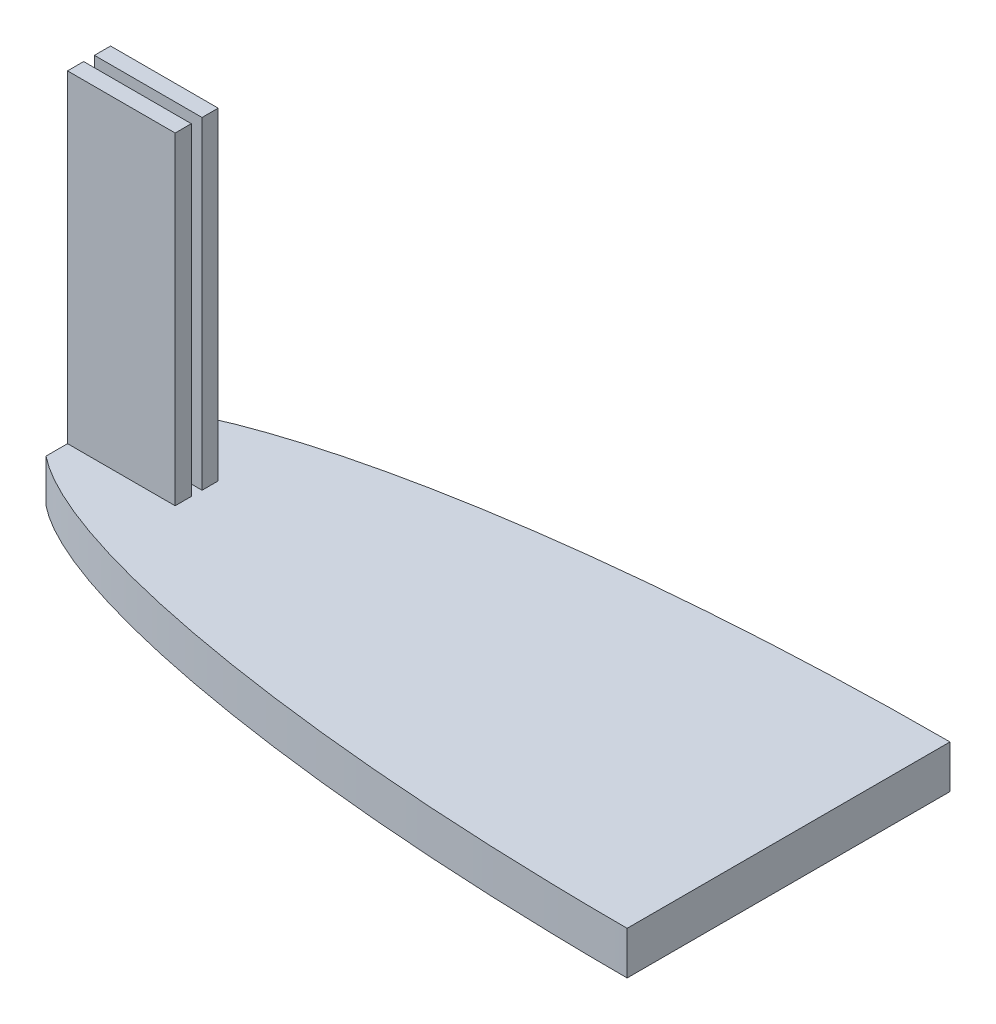
ISO-10303-21;
HEADER;
FILE_DESCRIPTION(('STEP AP214'),'2;1');
FILE_NAME('part.step','',(''),(''),'','','');
FILE_SCHEMA(('AUTOMOTIVE_DESIGN { 1 0 10303 214 1 1 1 1 }'));
ENDSEC;
DATA;
#1=APPLICATION_CONTEXT('core data for automotive mechanical design processes');
#2=APPLICATION_PROTOCOL_DEFINITION('international standard','automotive_design',2000,#1);
#3=PRODUCT_CONTEXT('',#1,'mechanical');
#4=PRODUCT('Part','Part','',(#3));
#5=PRODUCT_RELATED_PRODUCT_CATEGORY('part','',(#4));
#6=PRODUCT_DEFINITION_FORMATION('','',#4);
#7=PRODUCT_DEFINITION_CONTEXT('part definition',#1,'design');
#8=PRODUCT_DEFINITION('design','',#6,#7);
#9=PRODUCT_DEFINITION_SHAPE('','',#8);
#10=(LENGTH_UNIT() NAMED_UNIT(*) SI_UNIT(.MILLI.,.METRE.));
#11=(NAMED_UNIT(*) PLANE_ANGLE_UNIT() SI_UNIT($,.RADIAN.));
#12=(NAMED_UNIT(*) SI_UNIT($,.STERADIAN.) SOLID_ANGLE_UNIT());
#13=UNCERTAINTY_MEASURE_WITH_UNIT(LENGTH_MEASURE(1.E-05),#10,'distance_accuracy_value','');
#14=(GEOMETRIC_REPRESENTATION_CONTEXT(3) GLOBAL_UNCERTAINTY_ASSIGNED_CONTEXT((#13)) GLOBAL_UNIT_ASSIGNED_CONTEXT((#10,
#11,#12)) REPRESENTATION_CONTEXT('',''));
#15=CARTESIAN_POINT('',(0.,0.,0.));
#16=DIRECTION('',(0.,0.,1.));
#17=DIRECTION('',(1.,0.,0.));
#18=AXIS2_PLACEMENT_3D('',#15,#16,#17);
#19=CARTESIAN_POINT('',(0.,4.,0.));
#20=DIRECTION('',(0.,1.,0.));
#21=DIRECTION('',(0.,0.,1.));
#22=AXIS2_PLACEMENT_3D('',#19,#20,#21);
#23=PLANE('',#22);
#24=DIRECTION('',(0.,0.,-1.));
#25=VECTOR('',#24,1.);
#26=CARTESIAN_POINT('',(-22.5,4.,2.));
#27=LINE('',#26,#25);
#28=CARTESIAN_POINT('',(-22.5,4.,2.));
#29=VERTEX_POINT('',#28);
#30=CARTESIAN_POINT('',(-22.5,4.,0.500000000000002));
#31=VERTEX_POINT('',#30);
#32=EDGE_CURVE('E255',#29,#31,#27,.T.);
#33=ORIENTED_EDGE('',*,*,#32,.F.);
#34=DIRECTION('',(1.,0.,0.));
#35=VECTOR('',#34,1.);
#36=CARTESIAN_POINT('',(-32.5,4.,2.));
#37=LINE('',#36,#35);
#38=CARTESIAN_POINT('',(-32.5,4.,2.));
#39=VERTEX_POINT('',#38);
#40=EDGE_CURVE('E230',#39,#29,#37,.T.);
#41=ORIENTED_EDGE('',*,*,#40,.F.);
#42=DIRECTION('',(0.,0.,1.));
#43=VECTOR('',#42,1.);
#44=CARTESIAN_POINT('',(-32.5,4.,0.));
#45=LINE('',#44,#43);
#46=CARTESIAN_POINT('',(-32.5,4.,3.99999999999999));
#47=VERTEX_POINT('',#46);
#48=EDGE_CURVE('E148',#39,#47,#45,.T.);
#49=ORIENTED_EDGE('',*,*,#48,.T.);
#50=CARTESIAN_POINT('',(32.5,4.,0.));
#51=DIRECTION('',(0.,1.,0.));
#52=DIRECTION('',(1.,0.,0.));
#53=AXIS2_PLACEMENT_3D('',#50,#51,#52);
#54=ELLIPSE('',#53,67.4421602269423,15.);
#55=CARTESIAN_POINT('',(32.5,4.,15.));
#56=VERTEX_POINT('',#55);
#57=EDGE_CURVE('E202',#47,#56,#54,.T.);
#58=ORIENTED_EDGE('',*,*,#57,.T.);
#59=DIRECTION('',(0.,0.,-1.));
#60=VECTOR('',#59,1.);
#61=CARTESIAN_POINT('',(32.5,4.,0.));
#62=LINE('',#61,#60);
#63=CARTESIAN_POINT('',(32.5,4.,-15.));
#64=VERTEX_POINT('',#63);
#65=EDGE_CURVE('E181',#56,#64,#62,.T.);
#66=ORIENTED_EDGE('',*,*,#65,.T.);
#67=CARTESIAN_POINT('',(32.5,4.,0.));
#68=DIRECTION('',(0.,1.,0.));
#69=DIRECTION('',(1.,0.,0.));
#70=AXIS2_PLACEMENT_3D('',#67,#68,#69);
#71=ELLIPSE('',#70,67.4421602269423,15.);
#72=CARTESIAN_POINT('',(-32.5,4.,-4.00000000000001));
#73=VERTEX_POINT('',#72);
#74=EDGE_CURVE('E184',#64,#73,#71,.T.);
#75=ORIENTED_EDGE('',*,*,#74,.T.);
#76=CARTESIAN_POINT('',(-32.5,4.,-2.));
#77=VERTEX_POINT('',#76);
#78=EDGE_CURVE('E188',#73,#77,#45,.T.);
#79=ORIENTED_EDGE('',*,*,#78,.T.);
#80=DIRECTION('',(-1.,0.,0.));
#81=VECTOR('',#80,1.);
#82=CARTESIAN_POINT('',(-32.5,4.,-2.));
#83=LINE('',#82,#81);
#84=CARTESIAN_POINT('',(-22.5,4.,-2.));
#85=VERTEX_POINT('',#84);
#86=EDGE_CURVE('E150',#85,#77,#83,.T.);
#87=ORIENTED_EDGE('',*,*,#86,.F.);
#88=DIRECTION('',(0.,0.,-1.));
#89=VECTOR('',#88,1.);
#90=CARTESIAN_POINT('',(-22.5,4.,-0.499999999999996));
#91=LINE('',#90,#89);
#92=CARTESIAN_POINT('',(-22.5,4.,-0.499999999999996));
#93=VERTEX_POINT('',#92);
#94=EDGE_CURVE('E58',#93,#85,#91,.T.);
#95=ORIENTED_EDGE('',*,*,#94,.F.);
#96=DIRECTION('',(1.,0.,0.));
#97=VECTOR('',#96,1.);
#98=CARTESIAN_POINT('',(-32.5,4.,-0.499999999999996));
#99=LINE('',#98,#97);
#100=CARTESIAN_POINT('',(-32.5,4.,-0.499999999999996));
#101=VERTEX_POINT('',#100);
#102=EDGE_CURVE('E159',#101,#93,#99,.T.);
#103=ORIENTED_EDGE('',*,*,#102,.F.);
#104=CARTESIAN_POINT('',(-32.5,4.,0.500000000000004));
#105=VERTEX_POINT('',#104);
#106=EDGE_CURVE('E231',#101,#105,#45,.T.);
#107=ORIENTED_EDGE('',*,*,#106,.T.);
#108=DIRECTION('',(-1.,0.,0.));
#109=VECTOR('',#108,1.);
#110=CARTESIAN_POINT('',(-32.5,4.,0.500000000000004));
#111=LINE('',#110,#109);
#112=EDGE_CURVE('E143',#31,#105,#111,.T.);
#113=ORIENTED_EDGE('',*,*,#112,.F.);
#114=EDGE_LOOP('',(#33,#41,#49,#58,#66,#75,#79,#87,#95,#103,#107,#113));
#115=FACE_BOUND('',#114,.T.);
#116=ADVANCED_FACE('F35',(#115),#23,.T.);
#117=CARTESIAN_POINT('',(32.5,4.,0.));
#118=DIRECTION('',(-1.,0.,0.));
#119=DIRECTION('',(0.,0.,1.));
#120=AXIS2_PLACEMENT_3D('',#117,#118,#119);
#121=PLANE('',#120);
#122=DIRECTION('',(0.,0.,-1.));
#123=VECTOR('',#122,1.);
#124=CARTESIAN_POINT('',(32.5,0.,0.));
#125=LINE('',#124,#123);
#126=CARTESIAN_POINT('',(32.5,0.,15.));
#127=VERTEX_POINT('',#126);
#128=CARTESIAN_POINT('',(32.5,0.,-15.));
#129=VERTEX_POINT('',#128);
#130=EDGE_CURVE('E180',#127,#129,#125,.T.);
#131=ORIENTED_EDGE('',*,*,#130,.T.);
#132=DIRECTION('',(0.,-1.,0.));
#133=VECTOR('',#132,1.);
#134=CARTESIAN_POINT('',(32.5,4.,-15.));
#135=LINE('',#134,#133);
#136=EDGE_CURVE('E11',#64,#129,#135,.T.);
#137=ORIENTED_EDGE('',*,*,#136,.F.);
#138=ORIENTED_EDGE('',*,*,#65,.F.);
#139=DIRECTION('',(0.,-1.,0.));
#140=VECTOR('',#139,1.);
#141=CARTESIAN_POINT('',(32.5,4.,15.));
#142=LINE('',#141,#140);
#143=EDGE_CURVE('E205',#56,#127,#142,.T.);
#144=ORIENTED_EDGE('',*,*,#143,.T.);
#145=EDGE_LOOP('',(#131,#137,#138,#144));
#146=FACE_BOUND('',#145,.T.);
#147=ADVANCED_FACE('F37',(#146),#121,.F.);
#148=DIRECTION('',(0.,-1.,0.));
#149=VECTOR('',#148,1.);
#150=SURFACE_OF_LINEAR_EXTRUSION('',#71,#149);
#151=CARTESIAN_POINT('',(32.5,0.,0.));
#152=DIRECTION('',(0.,1.,0.));
#153=DIRECTION('',(1.,0.,0.));
#154=AXIS2_PLACEMENT_3D('',#151,#152,#153);
#155=ELLIPSE('',#154,67.4421602269423,15.);
#156=CARTESIAN_POINT('',(-32.5,0.,-4.00000000000001));
#157=VERTEX_POINT('',#156);
#158=EDGE_CURVE('E208',#129,#157,#155,.T.);
#159=ORIENTED_EDGE('',*,*,#158,.T.);
#160=DIRECTION('',(0.,-1.,0.));
#161=VECTOR('',#160,1.);
#162=CARTESIAN_POINT('',(-32.5,4.,-4.00000000000001));
#163=LINE('',#162,#161);
#164=EDGE_CURVE('E43',#73,#157,#163,.T.);
#165=ORIENTED_EDGE('',*,*,#164,.F.);
#166=ORIENTED_EDGE('',*,*,#74,.F.);
#167=ORIENTED_EDGE('',*,*,#136,.T.);
#168=EDGE_LOOP('',(#159,#165,#166,#167));
#169=FACE_BOUND('',#168,.T.);
#170=ADVANCED_FACE('F190',(#169),#150,.F.);
#171=CARTESIAN_POINT('',(-32.5,4.,0.));
#172=DIRECTION('',(1.,0.,0.));
#173=DIRECTION('',(0.,0.,-1.));
#174=AXIS2_PLACEMENT_3D('',#171,#172,#173);
#175=PLANE('',#174);
#176=DIRECTION('',(0.,0.,1.));
#177=VECTOR('',#176,1.);
#178=CARTESIAN_POINT('',(-32.5,0.,0.));
#179=LINE('',#178,#177);
#180=CARTESIAN_POINT('',(-32.5,0.,3.99999999999999));
#181=VERTEX_POINT('',#180);
#182=EDGE_CURVE('E210',#157,#181,#179,.T.);
#183=ORIENTED_EDGE('',*,*,#182,.T.);
#184=DIRECTION('',(0.,-1.,0.));
#185=VECTOR('',#184,1.);
#186=CARTESIAN_POINT('',(-32.5,4.,3.99999999999999));
#187=LINE('',#186,#185);
#188=EDGE_CURVE('E215',#47,#181,#187,.T.);
#189=ORIENTED_EDGE('',*,*,#188,.F.);
#190=ORIENTED_EDGE('',*,*,#48,.F.);
#191=DIRECTION('',(0.,-1.,0.));
#192=VECTOR('',#191,1.);
#193=CARTESIAN_POINT('',(-32.5,34.,2.));
#194=LINE('',#193,#192);
#195=CARTESIAN_POINT('',(-32.5,34.,2.));
#196=VERTEX_POINT('',#195);
#197=EDGE_CURVE('E128',#196,#39,#194,.T.);
#198=ORIENTED_EDGE('',*,*,#197,.F.);
#199=DIRECTION('',(0.,0.,1.));
#200=VECTOR('',#199,1.);
#201=CARTESIAN_POINT('',(-32.5,34.,0.500000000000004));
#202=LINE('',#201,#200);
#203=CARTESIAN_POINT('',(-32.5,34.,0.500000000000004));
#204=VERTEX_POINT('',#203);
#205=EDGE_CURVE('E135',#204,#196,#202,.T.);
#206=ORIENTED_EDGE('',*,*,#205,.F.);
#207=DIRECTION('',(0.,-1.,0.));
#208=VECTOR('',#207,1.);
#209=CARTESIAN_POINT('',(-32.5,34.,0.500000000000004));
#210=LINE('',#209,#208);
#211=EDGE_CURVE('E250',#204,#105,#210,.T.);
#212=ORIENTED_EDGE('',*,*,#211,.T.);
#213=ORIENTED_EDGE('',*,*,#106,.F.);
#214=DIRECTION('',(0.,-1.,0.));
#215=VECTOR('',#214,1.);
#216=CARTESIAN_POINT('',(-32.5,34.,-0.499999999999996));
#217=LINE('',#216,#215);
#218=CARTESIAN_POINT('',(-32.5,34.,-0.499999999999996));
#219=VERTEX_POINT('',#218);
#220=EDGE_CURVE('E171',#219,#101,#217,.T.);
#221=ORIENTED_EDGE('',*,*,#220,.F.);
#222=DIRECTION('',(0.,0.,1.));
#223=VECTOR('',#222,1.);
#224=CARTESIAN_POINT('',(-32.5,34.,-0.499999999999996));
#225=LINE('',#224,#223);
#226=CARTESIAN_POINT('',(-32.5,34.,-2.));
#227=VERTEX_POINT('',#226);
#228=EDGE_CURVE('E161',#227,#219,#225,.T.);
#229=ORIENTED_EDGE('',*,*,#228,.F.);
#230=DIRECTION('',(0.,-1.,0.));
#231=VECTOR('',#230,1.);
#232=CARTESIAN_POINT('',(-32.5,34.,-2.));
#233=LINE('',#232,#231);
#234=EDGE_CURVE('E174',#227,#77,#233,.T.);
#235=ORIENTED_EDGE('',*,*,#234,.T.);
#236=ORIENTED_EDGE('',*,*,#78,.F.);
#237=ORIENTED_EDGE('',*,*,#164,.T.);
#238=EDGE_LOOP('',(#183,#189,#190,#198,#206,#212,#213,#221,#229,#235,#236,#237));
#239=FACE_BOUND('',#238,.T.);
#240=ADVANCED_FACE('F146',(#239),#175,.F.);
#241=DIRECTION('',(0.,-1.,0.));
#242=VECTOR('',#241,1.);
#243=SURFACE_OF_LINEAR_EXTRUSION('',#54,#242);
#244=CARTESIAN_POINT('',(32.5,0.,0.));
#245=DIRECTION('',(0.,1.,0.));
#246=DIRECTION('',(1.,0.,0.));
#247=AXIS2_PLACEMENT_3D('',#244,#245,#246);
#248=ELLIPSE('',#247,67.4421602269423,15.);
#249=EDGE_CURVE('E185',#181,#127,#248,.T.);
#250=ORIENTED_EDGE('',*,*,#249,.T.);
#251=ORIENTED_EDGE('',*,*,#143,.F.);
#252=ORIENTED_EDGE('',*,*,#57,.F.);
#253=ORIENTED_EDGE('',*,*,#188,.T.);
#254=EDGE_LOOP('',(#250,#251,#252,#253));
#255=FACE_BOUND('',#254,.T.);
#256=ADVANCED_FACE('F196',(#255),#243,.F.);
#257=CARTESIAN_POINT('',(0.,0.,0.));
#258=DIRECTION('',(0.,1.,0.));
#259=DIRECTION('',(0.,0.,1.));
#260=AXIS2_PLACEMENT_3D('',#257,#258,#259);
#261=PLANE('',#260);
#262=ORIENTED_EDGE('',*,*,#130,.F.);
#263=ORIENTED_EDGE('',*,*,#249,.F.);
#264=ORIENTED_EDGE('',*,*,#182,.F.);
#265=ORIENTED_EDGE('',*,*,#158,.F.);
#266=EDGE_LOOP('',(#262,#263,#264,#265));
#267=FACE_BOUND('',#266,.T.);
#268=ADVANCED_FACE('F199',(#267),#261,.F.);
#269=CARTESIAN_POINT('',(-22.5,34.,-0.499999999999996));
#270=DIRECTION('',(-1.,0.,0.));
#271=DIRECTION('',(0.,0.,1.));
#272=AXIS2_PLACEMENT_3D('',#269,#270,#271);
#273=PLANE('',#272);
#274=ORIENTED_EDGE('',*,*,#94,.T.);
#275=DIRECTION('',(0.,-1.,0.));
#276=VECTOR('',#275,1.);
#277=CARTESIAN_POINT('',(-22.5,34.,-2.));
#278=LINE('',#277,#276);
#279=CARTESIAN_POINT('',(-22.5,34.,-2.));
#280=VERTEX_POINT('',#279);
#281=EDGE_CURVE('E177',#280,#85,#278,.T.);
#282=ORIENTED_EDGE('',*,*,#281,.F.);
#283=DIRECTION('',(0.,0.,-1.));
#284=VECTOR('',#283,1.);
#285=CARTESIAN_POINT('',(-22.5,34.,-0.499999999999996));
#286=LINE('',#285,#284);
#287=CARTESIAN_POINT('',(-22.5,34.,-0.499999999999996));
#288=VERTEX_POINT('',#287);
#289=EDGE_CURVE('E155',#288,#280,#286,.T.);
#290=ORIENTED_EDGE('',*,*,#289,.F.);
#291=DIRECTION('',(0.,-1.,0.));
#292=VECTOR('',#291,1.);
#293=CARTESIAN_POINT('',(-22.5,34.,-0.499999999999996));
#294=LINE('',#293,#292);
#295=EDGE_CURVE('E164',#288,#93,#294,.T.);
#296=ORIENTED_EDGE('',*,*,#295,.T.);
#297=EDGE_LOOP('',(#274,#282,#290,#296));
#298=FACE_BOUND('',#297,.T.);
#299=ADVANCED_FACE('F246',(#298),#273,.F.);
#300=CARTESIAN_POINT('',(-32.5,34.,-2.));
#301=DIRECTION('',(0.,0.,1.));
#302=DIRECTION('',(1.,0.,0.));
#303=AXIS2_PLACEMENT_3D('',#300,#301,#302);
#304=PLANE('',#303);
#305=ORIENTED_EDGE('',*,*,#86,.T.);
#306=ORIENTED_EDGE('',*,*,#234,.F.);
#307=DIRECTION('',(-1.,0.,0.));
#308=VECTOR('',#307,1.);
#309=CARTESIAN_POINT('',(-32.5,34.,-2.));
#310=LINE('',#309,#308);
#311=EDGE_CURVE('E158',#280,#227,#310,.T.);
#312=ORIENTED_EDGE('',*,*,#311,.F.);
#313=ORIENTED_EDGE('',*,*,#281,.T.);
#314=EDGE_LOOP('',(#305,#306,#312,#313));
#315=FACE_BOUND('',#314,.T.);
#316=ADVANCED_FACE('F235',(#315),#304,.F.);
#317=CARTESIAN_POINT('',(-32.5,34.,-0.499999999999996));
#318=DIRECTION('',(0.,0.,-1.));
#319=DIRECTION('',(-1.,0.,0.));
#320=AXIS2_PLACEMENT_3D('',#317,#318,#319);
#321=PLANE('',#320);
#322=ORIENTED_EDGE('',*,*,#102,.T.);
#323=ORIENTED_EDGE('',*,*,#295,.F.);
#324=DIRECTION('',(1.,0.,0.));
#325=VECTOR('',#324,1.);
#326=CARTESIAN_POINT('',(-32.5,34.,-0.499999999999996));
#327=LINE('',#326,#325);
#328=EDGE_CURVE('E163',#219,#288,#327,.T.);
#329=ORIENTED_EDGE('',*,*,#328,.F.);
#330=ORIENTED_EDGE('',*,*,#220,.T.);
#331=EDGE_LOOP('',(#322,#323,#329,#330));
#332=FACE_BOUND('',#331,.T.);
#333=ADVANCED_FACE('F248',(#332),#321,.F.);
#334=CARTESIAN_POINT('',(0.,34.,0.));
#335=DIRECTION('',(0.,-1.,0.));
#336=DIRECTION('',(0.,0.,-1.));
#337=AXIS2_PLACEMENT_3D('',#334,#335,#336);
#338=PLANE('',#337);
#339=ORIENTED_EDGE('',*,*,#289,.T.);
#340=ORIENTED_EDGE('',*,*,#311,.T.);
#341=ORIENTED_EDGE('',*,*,#228,.T.);
#342=ORIENTED_EDGE('',*,*,#328,.T.);
#343=EDGE_LOOP('',(#339,#340,#341,#342));
#344=FACE_BOUND('',#343,.T.);
#345=ADVANCED_FACE('F242',(#344),#338,.F.);
#346=CARTESIAN_POINT('',(-32.5,34.,2.));
#347=DIRECTION('',(0.,0.,-1.));
#348=DIRECTION('',(-1.,0.,0.));
#349=AXIS2_PLACEMENT_3D('',#346,#347,#348);
#350=PLANE('',#349);
#351=ORIENTED_EDGE('',*,*,#40,.T.);
#352=DIRECTION('',(0.,-1.,0.));
#353=VECTOR('',#352,1.);
#354=CARTESIAN_POINT('',(-22.5,34.,2.));
#355=LINE('',#354,#353);
#356=CARTESIAN_POINT('',(-22.5,34.,2.));
#357=VERTEX_POINT('',#356);
#358=EDGE_CURVE('E131',#357,#29,#355,.T.);
#359=ORIENTED_EDGE('',*,*,#358,.F.);
#360=DIRECTION('',(1.,0.,0.));
#361=VECTOR('',#360,1.);
#362=CARTESIAN_POINT('',(-32.5,34.,2.));
#363=LINE('',#362,#361);
#364=EDGE_CURVE('E124',#196,#357,#363,.T.);
#365=ORIENTED_EDGE('',*,*,#364,.F.);
#366=ORIENTED_EDGE('',*,*,#197,.T.);
#367=EDGE_LOOP('',(#351,#359,#365,#366));
#368=FACE_BOUND('',#367,.T.);
#369=ADVANCED_FACE('F126',(#368),#350,.F.);
#370=CARTESIAN_POINT('',(-22.5,34.,2.));
#371=DIRECTION('',(-1.,0.,0.));
#372=DIRECTION('',(0.,0.,1.));
#373=AXIS2_PLACEMENT_3D('',#370,#371,#372);
#374=PLANE('',#373);
#375=ORIENTED_EDGE('',*,*,#32,.T.);
#376=DIRECTION('',(0.,-1.,0.));
#377=VECTOR('',#376,1.);
#378=CARTESIAN_POINT('',(-22.5,34.,0.500000000000002));
#379=LINE('',#378,#377);
#380=CARTESIAN_POINT('',(-22.5,34.,0.500000000000002));
#381=VERTEX_POINT('',#380);
#382=EDGE_CURVE('E50',#381,#31,#379,.T.);
#383=ORIENTED_EDGE('',*,*,#382,.F.);
#384=DIRECTION('',(0.,0.,-1.));
#385=VECTOR('',#384,1.);
#386=CARTESIAN_POINT('',(-22.5,34.,2.));
#387=LINE('',#386,#385);
#388=EDGE_CURVE('E134',#357,#381,#387,.T.);
#389=ORIENTED_EDGE('',*,*,#388,.F.);
#390=ORIENTED_EDGE('',*,*,#358,.T.);
#391=EDGE_LOOP('',(#375,#383,#389,#390));
#392=FACE_BOUND('',#391,.T.);
#393=ADVANCED_FACE('F259',(#392),#374,.F.);
#394=CARTESIAN_POINT('',(-32.5,34.,0.500000000000004));
#395=DIRECTION('',(0.,0.,1.));
#396=DIRECTION('',(1.,0.,0.));
#397=AXIS2_PLACEMENT_3D('',#394,#395,#396);
#398=PLANE('',#397);
#399=ORIENTED_EDGE('',*,*,#112,.T.);
#400=ORIENTED_EDGE('',*,*,#211,.F.);
#401=DIRECTION('',(-1.,0.,0.));
#402=VECTOR('',#401,1.);
#403=CARTESIAN_POINT('',(-32.5,34.,0.500000000000004));
#404=LINE('',#403,#402);
#405=EDGE_CURVE('E139',#381,#204,#404,.T.);
#406=ORIENTED_EDGE('',*,*,#405,.F.);
#407=ORIENTED_EDGE('',*,*,#382,.T.);
#408=EDGE_LOOP('',(#399,#400,#406,#407));
#409=FACE_BOUND('',#408,.T.);
#410=ADVANCED_FACE('F260',(#409),#398,.F.);
#411=CARTESIAN_POINT('',(0.,34.,0.));
#412=DIRECTION('',(0.,1.,0.));
#413=DIRECTION('',(0.,0.,1.));
#414=AXIS2_PLACEMENT_3D('',#411,#412,#413);
#415=PLANE('',#414);
#416=ORIENTED_EDGE('',*,*,#205,.T.);
#417=ORIENTED_EDGE('',*,*,#364,.T.);
#418=ORIENTED_EDGE('',*,*,#388,.T.);
#419=ORIENTED_EDGE('',*,*,#405,.T.);
#420=EDGE_LOOP('',(#416,#417,#418,#419));
#421=FACE_BOUND('',#420,.T.);
#422=ADVANCED_FACE('F138',(#421),#415,.T.);
#423=CLOSED_SHELL('',(#116,#147,#170,#240,#256,#268,#299,#316,#333,#345,#369,#393,#410,#422));
#424=MANIFOLD_SOLID_BREP('B2',#423);
#425=ADVANCED_BREP_SHAPE_REPRESENTATION('',(#18,#424),#14);
#426=SHAPE_DEFINITION_REPRESENTATION(#9,#425);
ENDSEC;
END-ISO-10303-21;
